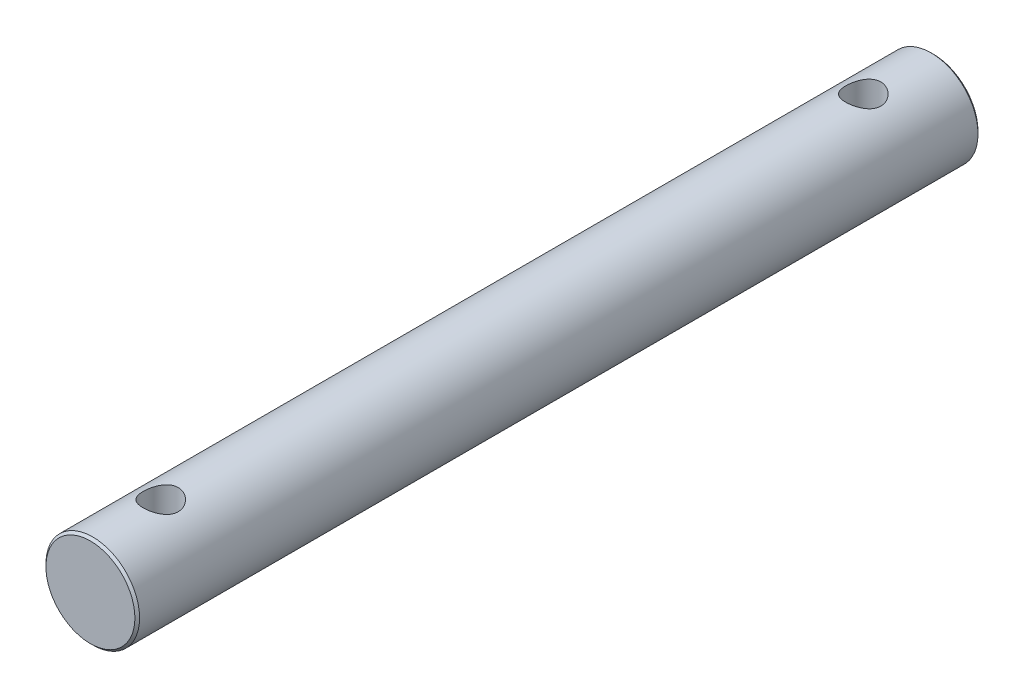
ISO-10303-21;
HEADER;
FILE_DESCRIPTION(('STEP AP214'),'2;1');
FILE_NAME('part.step','',(''),(''),'','','');
FILE_SCHEMA(('AUTOMOTIVE_DESIGN { 1 0 10303 214 1 1 1 1 }'));
ENDSEC;
DATA;
#1=APPLICATION_CONTEXT('core data for automotive mechanical design processes');
#2=APPLICATION_PROTOCOL_DEFINITION('international standard','automotive_design',2000,#1);
#3=PRODUCT_CONTEXT('',#1,'mechanical');
#4=PRODUCT('Part','Part','',(#3));
#5=PRODUCT_RELATED_PRODUCT_CATEGORY('part','',(#4));
#6=PRODUCT_DEFINITION_FORMATION('','',#4);
#7=PRODUCT_DEFINITION_CONTEXT('part definition',#1,'design');
#8=PRODUCT_DEFINITION('design','',#6,#7);
#9=PRODUCT_DEFINITION_SHAPE('','',#8);
#10=(LENGTH_UNIT() NAMED_UNIT(*) SI_UNIT(.MILLI.,.METRE.));
#11=(NAMED_UNIT(*) PLANE_ANGLE_UNIT() SI_UNIT($,.RADIAN.));
#12=(NAMED_UNIT(*) SI_UNIT($,.STERADIAN.) SOLID_ANGLE_UNIT());
#13=UNCERTAINTY_MEASURE_WITH_UNIT(LENGTH_MEASURE(1.E-05),#10,'distance_accuracy_value','');
#14=(GEOMETRIC_REPRESENTATION_CONTEXT(3) GLOBAL_UNCERTAINTY_ASSIGNED_CONTEXT((#13)) GLOBAL_UNIT_ASSIGNED_CONTEXT((#10,
#11,#12)) REPRESENTATION_CONTEXT('',''));
#15=CARTESIAN_POINT('',(0.,0.,0.));
#16=DIRECTION('',(0.,0.,1.));
#17=DIRECTION('',(1.,0.,0.));
#18=AXIS2_PLACEMENT_3D('',#15,#16,#17);
#19=CARTESIAN_POINT('',(0.,0.,26.));
#20=DIRECTION('',(0.,0.,-1.));
#21=DIRECTION('',(-1.,0.,0.));
#22=AXIS2_PLACEMENT_3D('',#19,#20,#21);
#23=CYLINDRICAL_SURFACE('',#22,4.);
#24=CARTESIAN_POINT('',(0.,0.,-35.8));
#25=DIRECTION('',(0.,0.,1.));
#26=DIRECTION('',(1.,0.,0.));
#27=AXIS2_PLACEMENT_3D('',#24,#25,#26);
#28=CIRCLE('',#27,4.);
#29=CARTESIAN_POINT('',(4.,0.,-35.8));
#30=VERTEX_POINT('',#29);
#31=EDGE_CURVE('E44',#30,#30,#28,.T.);
#32=ORIENTED_EDGE('',*,*,#31,.T.);
#33=EDGE_LOOP('',(#32));
#34=FACE_BOUND('',#33,.T.);
#35=CARTESIAN_POINT('',(0.,0.,35.8));
#36=DIRECTION('',(0.,0.,1.));
#37=DIRECTION('',(1.,0.,0.));
#38=AXIS2_PLACEMENT_3D('',#35,#36,#37);
#39=CIRCLE('',#38,4.);
#40=CARTESIAN_POINT('',(4.,0.,35.8));
#41=VERTEX_POINT('',#40);
#42=EDGE_CURVE('E48',#41,#41,#39,.F.);
#43=ORIENTED_EDGE('',*,*,#42,.T.);
#44=EDGE_LOOP('',(#43));
#45=FACE_BOUND('',#44,.T.);
#46=CARTESIAN_POINT('',(0.,-4.,-28.5));
#47=CARTESIAN_POINT('',(0.0812350589378531,-4.00000217456151,-28.4999970976969));
#48=CARTESIAN_POINT('',(0.162450241781793,-3.99750379283184,-28.5066197602484));
#49=CARTESIAN_POINT('',(0.322453452352362,-3.98778696006928,-28.5328281952699));
#50=CARTESIAN_POINT('',(0.401241827987616,-3.98056918893993,-28.5524121004706));
#51=CARTESIAN_POINT('',(0.554060784990879,-3.96218832391545,-28.6037530017718));
#52=CARTESIAN_POINT('',(0.628100224162277,-3.9510328434944,-28.6354865168218));
#53=CARTESIAN_POINT('',(0.769799310160253,-3.92588767765353,-28.7101064130158));
#54=CARTESIAN_POINT('',(0.83745723917788,-3.91189723227548,-28.7529957855442));
#55=CARTESIAN_POINT('',(0.967346417045827,-3.88186246971217,-28.8506125310709));
#56=CARTESIAN_POINT('',(1.02927073015119,-3.86576002583566,-28.9057302622594));
#57=CARTESIAN_POINT('',(1.14324421474363,-3.83360220871327,-29.0254104346588));
#58=CARTESIAN_POINT('',(1.19529036359203,-3.81754685135033,-29.0899757560879));
#59=CARTESIAN_POINT('',(1.28998202215985,-3.78662470617731,-29.2297174675232));
#60=CARTESIAN_POINT('',(1.3321939319576,-3.77182648820818,-29.3052043665458));
#61=CARTESIAN_POINT('',(1.40318646334085,-3.74599860237433,-29.4628483541685));
#62=CARTESIAN_POINT('',(1.43197244961239,-3.73496742975881,-29.5450027631551));
#63=CARTESIAN_POINT('',(1.47408431017549,-3.71854412824136,-29.7101167402582));
#64=CARTESIAN_POINT('',(1.48799593218558,-3.71293924350838,-29.7929050384354));
#65=CARTESIAN_POINT('',(1.50179556531648,-3.70738061461215,-29.9598161579938));
#66=CARTESIAN_POINT('',(1.50168936802631,-3.70742453659305,-30.0439384138745));
#67=CARTESIAN_POINT('',(1.48790429610018,-3.71297511632055,-30.205769525213));
#68=CARTESIAN_POINT('',(1.47503808509004,-3.71815468871121,-30.2835609060442));
#69=CARTESIAN_POINT('',(1.4374416786833,-3.73284938059529,-30.4357871504053));
#70=CARTESIAN_POINT('',(1.41270969663258,-3.74236515298863,-30.5102215066139));
#71=CARTESIAN_POINT('',(1.35163748571904,-3.76485702190253,-30.6552770677282));
#72=CARTESIAN_POINT('',(1.31508648737101,-3.77789517988166,-30.7257994861213));
#73=CARTESIAN_POINT('',(1.23156073762698,-3.80594210139319,-30.859945737591));
#74=CARTESIAN_POINT('',(1.18458238728897,-3.82095154457158,-30.9235671775197));
#75=CARTESIAN_POINT('',(1.07781780766549,-3.85248038859113,-31.0466036636509));
#76=CARTESIAN_POINT('',(1.01738298716955,-3.86903347455671,-31.1054486407481));
#77=CARTESIAN_POINT('',(0.887312590819019,-3.90091728164085,-31.2123379662058));
#78=CARTESIAN_POINT('',(0.817675603497362,-3.91624781465952,-31.2603806546057));
#79=CARTESIAN_POINT('',(0.669723436992418,-3.9442639480908,-31.3449303970625));
#80=CARTESIAN_POINT('',(0.591290713844717,-3.95690498259616,-31.3812475812211));
#81=CARTESIAN_POINT('',(0.428836850524581,-3.97778718326962,-31.43998260427));
#82=CARTESIAN_POINT('',(0.344818210845766,-3.98603030341493,-31.4624066165611));
#83=CARTESIAN_POINT('',(0.178375243148665,-3.99684443228065,-31.4916227875419));
#84=CARTESIAN_POINT('',(0.0961036195622091,-3.99969369025686,-31.4991826063825));
#85=CARTESIAN_POINT('',(-0.0685724752550243,-4.00025893700126,-31.5006910638999));
#86=CARTESIAN_POINT('',(-0.150976912983373,-3.99797606386863,-31.4946427203168));
#87=CARTESIAN_POINT('',(-0.310262048561861,-3.98871709772643,-31.4696899576913));
#88=CARTESIAN_POINT('',(-0.387233328007337,-3.98192470962305,-31.4512884562629));
#89=CARTESIAN_POINT('',(-0.536941754957223,-3.96451477091717,-31.4028139274527));
#90=CARTESIAN_POINT('',(-0.609678350347536,-3.9538967228203,-31.372739382052));
#91=CARTESIAN_POINT('',(-0.751247765110158,-3.92949624407681,-31.3008135875605));
#92=CARTESIAN_POINT('',(-0.819903083557798,-3.91563000209348,-31.2586422707766));
#93=CARTESIAN_POINT('',(-0.949392711726628,-3.88626671564664,-31.1640818968284));
#94=CARTESIAN_POINT('',(-1.01022412027045,-3.87076907009516,-31.1116890674548));
#95=CARTESIAN_POINT('',(-1.12603079874454,-3.83873329490989,-30.9945958778757));
#96=CARTESIAN_POINT('',(-1.18046154123569,-3.82218696503729,-30.9293578172273));
#97=CARTESIAN_POINT('',(-1.27771050031903,-3.79078815746854,-30.7903486152923));
#98=CARTESIAN_POINT('',(-1.32052767414519,-3.77593583194399,-30.7165767086115));
#99=CARTESIAN_POINT('',(-1.39337773518998,-3.74966829822463,-30.5619840132277));
#100=CARTESIAN_POINT('',(-1.42335685446918,-3.73826760328493,-30.4811352540896));
#101=CARTESIAN_POINT('',(-1.46907883466889,-3.72054032891005,-30.3149902363122));
#102=CARTESIAN_POINT('',(-1.48483050305535,-3.71421061057491,-30.2296967638019));
#103=CARTESIAN_POINT('',(-1.50086347097839,-3.70775894792573,-30.0629838404589));
#104=CARTESIAN_POINT('',(-1.50207331495838,-3.70726444523341,-29.9816673682831));
#105=CARTESIAN_POINT('',(-1.49136715641593,-3.71158412745292,-29.8200546837238));
#106=CARTESIAN_POINT('',(-1.47945239850124,-3.71639780898899,-29.7397583753284));
#107=CARTESIAN_POINT('',(-1.44355815630242,-3.73048141585432,-29.5849527732834));
#108=CARTESIAN_POINT('',(-1.41995798316524,-3.73961085376663,-29.5103416537547));
#109=CARTESIAN_POINT('',(-1.3616969677992,-3.76121548297845,-29.3660944915056));
#110=CARTESIAN_POINT('',(-1.32703332944945,-3.77369151995215,-29.2964597119299));
#111=CARTESIAN_POINT('',(-1.24552075938154,-3.80139723903964,-29.1601732103024));
#112=CARTESIAN_POINT('',(-1.1981283280301,-3.81673698440964,-29.0938692032001));
#113=CARTESIAN_POINT('',(-1.09334485729906,-3.84806246757177,-28.9698584390288));
#114=CARTESIAN_POINT('',(-1.03595064012808,-3.86404840943145,-28.9121544252132));
#115=CARTESIAN_POINT('',(-0.909080396784624,-3.89590424609881,-28.8037980441782));
#116=CARTESIAN_POINT('',(-0.839118644212992,-3.91172104900645,-28.7536962465653));
#117=CARTESIAN_POINT('',(-0.69121322320082,-3.94054514457031,-28.6659773447234));
#118=CARTESIAN_POINT('',(-0.61326893409062,-3.95355221851559,-28.6283612122636));
#119=CARTESIAN_POINT('',(-0.447999082002311,-3.9757429260668,-28.5656231709517));
#120=CARTESIAN_POINT('',(-0.360413422234207,-3.98473657158356,-28.5411129353981));
#121=CARTESIAN_POINT('',(-0.181875733606381,-3.99686242179587,-28.5083070400793));
#122=CARTESIAN_POINT('',(-0.0909254163648585,-3.99999756603967,-28.5000032485127));
#123=CARTESIAN_POINT('',(0.,-4.,-28.5));
#124=B_SPLINE_CURVE_WITH_KNOTS('',3,(#46,#47,#48,#49,#50,#51,#52,#53,#54,#55,#56,#57,#58,#59,
#60,#61,#62,#63,#64,#65,#66,#67,#68,#69,#70,#71,#72,#73,#74,#75,#76,#77,#78,#79,#80,#81,#82,#83,
#84,#85,#86,#87,#88,#89,#90,#91,#92,#93,#94,#95,#96,#97,#98,#99,#100,#101,#102,#103,#104,#105,
#106,#107,#108,#109,#110,#111,#112,#113,#114,#115,#116,#117,#118,#119,#120,#121,#122,#123),
.UNSPECIFIED.,.T.,.F.,(4,2,2,2,2,2,2,2,2,2,2,2,2,2,2,2,2,2,2,2,2,2,2,2,2,2,2,2,2,2,2,2,2,2,2,2,
2,2,4),(0.,0.24336980156056,0.486704549530461,0.729571369213572,0.972503379609491,
1.22473618582716,1.47704604925622,1.73896674501659,2.00078269352134,2.25185874416902,
2.50283106079707,2.73878345119972,2.9747713806059,3.21522408387019,3.45575990744259,
3.71246153335814,3.96920257905067,4.22991375286076,4.49050899698846,4.73725019635926,
4.98393668390521,5.22114437923841,5.45838293254454,5.70259221859601,5.94689180019869,
6.20536519455659,6.46386178920142,6.72343066727204,6.98283874956508,7.22558763480253,
7.4683135021126,7.70363142426535,7.93900886656507,8.18672471884272,8.43451941997063,
8.6957232965404,8.95694749805103,9.22948515032044,9.50188601796129),.UNSPECIFIED.);
#125=CARTESIAN_POINT('',(0.,-4.,-28.5));
#126=VERTEX_POINT('',#125);
#127=EDGE_CURVE('E85',#126,#126,#124,.T.);
#128=ORIENTED_EDGE('',*,*,#127,.T.);
#129=EDGE_LOOP('',(#128));
#130=FACE_BOUND('',#129,.T.);
#131=CARTESIAN_POINT('',(0.,4.,-28.5));
#132=CARTESIAN_POINT('',(-0.0812350589378531,4.00000217456151,-28.4999970976969));
#133=CARTESIAN_POINT('',(-0.162450241781793,3.99750379283184,-28.5066197602484));
#134=CARTESIAN_POINT('',(-0.322453452352362,3.98778696006928,-28.5328281952699));
#135=CARTESIAN_POINT('',(-0.401241827987616,3.98056918893993,-28.5524121004706));
#136=CARTESIAN_POINT('',(-0.554060784990879,3.96218832391545,-28.6037530017718));
#137=CARTESIAN_POINT('',(-0.628100224162277,3.9510328434944,-28.6354865168218));
#138=CARTESIAN_POINT('',(-0.769799310160253,3.92588767765353,-28.7101064130158));
#139=CARTESIAN_POINT('',(-0.83745723917788,3.91189723227548,-28.7529957855442));
#140=CARTESIAN_POINT('',(-0.967346417045827,3.88186246971217,-28.8506125310709));
#141=CARTESIAN_POINT('',(-1.02927073015119,3.86576002583566,-28.9057302622594));
#142=CARTESIAN_POINT('',(-1.14324421474363,3.83360220871327,-29.0254104346588));
#143=CARTESIAN_POINT('',(-1.19529036359203,3.81754685135033,-29.0899757560879));
#144=CARTESIAN_POINT('',(-1.28998202215985,3.78662470617731,-29.2297174675232));
#145=CARTESIAN_POINT('',(-1.3321939319576,3.77182648820818,-29.3052043665458));
#146=CARTESIAN_POINT('',(-1.40318646334085,3.74599860237433,-29.4628483541685));
#147=CARTESIAN_POINT('',(-1.43197244961239,3.73496742975881,-29.5450027631551));
#148=CARTESIAN_POINT('',(-1.47408431017549,3.71854412824136,-29.7101167402582));
#149=CARTESIAN_POINT('',(-1.48799593218558,3.71293924350838,-29.7929050384354));
#150=CARTESIAN_POINT('',(-1.50179556531648,3.70738061461215,-29.9598161579938));
#151=CARTESIAN_POINT('',(-1.50168936802631,3.70742453659305,-30.0439384138745));
#152=CARTESIAN_POINT('',(-1.48790429610018,3.71297511632055,-30.205769525213));
#153=CARTESIAN_POINT('',(-1.47503808509004,3.71815468871121,-30.2835609060442));
#154=CARTESIAN_POINT('',(-1.4374416786833,3.73284938059529,-30.4357871504053));
#155=CARTESIAN_POINT('',(-1.41270969663258,3.74236515298863,-30.5102215066139));
#156=CARTESIAN_POINT('',(-1.35163748571904,3.76485702190253,-30.6552770677282));
#157=CARTESIAN_POINT('',(-1.31508648737101,3.77789517988166,-30.7257994861213));
#158=CARTESIAN_POINT('',(-1.23156073762698,3.80594210139319,-30.859945737591));
#159=CARTESIAN_POINT('',(-1.18458238728897,3.82095154457158,-30.9235671775197));
#160=CARTESIAN_POINT('',(-1.07781780766549,3.85248038859113,-31.0466036636509));
#161=CARTESIAN_POINT('',(-1.01738298716955,3.86903347455671,-31.1054486407481));
#162=CARTESIAN_POINT('',(-0.887312590819019,3.90091728164085,-31.2123379662058));
#163=CARTESIAN_POINT('',(-0.817675603497362,3.91624781465952,-31.2603806546057));
#164=CARTESIAN_POINT('',(-0.669723436992418,3.9442639480908,-31.3449303970625));
#165=CARTESIAN_POINT('',(-0.591290713844717,3.95690498259616,-31.3812475812211));
#166=CARTESIAN_POINT('',(-0.428836850524581,3.97778718326962,-31.43998260427));
#167=CARTESIAN_POINT('',(-0.344818210845766,3.98603030341493,-31.4624066165611));
#168=CARTESIAN_POINT('',(-0.178375243148665,3.99684443228065,-31.4916227875419));
#169=CARTESIAN_POINT('',(-0.0961036195622091,3.99969369025686,-31.4991826063825));
#170=CARTESIAN_POINT('',(0.0685724752550243,4.00025893700126,-31.5006910638999));
#171=CARTESIAN_POINT('',(0.150976912983373,3.99797606386863,-31.4946427203168));
#172=CARTESIAN_POINT('',(0.310262048561861,3.98871709772643,-31.4696899576913));
#173=CARTESIAN_POINT('',(0.387233328007337,3.98192470962305,-31.4512884562629));
#174=CARTESIAN_POINT('',(0.536941754957223,3.96451477091717,-31.4028139274527));
#175=CARTESIAN_POINT('',(0.609678350347536,3.9538967228203,-31.372739382052));
#176=CARTESIAN_POINT('',(0.751247765110158,3.92949624407681,-31.3008135875605));
#177=CARTESIAN_POINT('',(0.819903083557798,3.91563000209348,-31.2586422707766));
#178=CARTESIAN_POINT('',(0.949392711726628,3.88626671564664,-31.1640818968284));
#179=CARTESIAN_POINT('',(1.01022412027045,3.87076907009516,-31.1116890674548));
#180=CARTESIAN_POINT('',(1.12603079874454,3.83873329490989,-30.9945958778757));
#181=CARTESIAN_POINT('',(1.18046154123569,3.82218696503729,-30.9293578172273));
#182=CARTESIAN_POINT('',(1.27771050031903,3.79078815746854,-30.7903486152923));
#183=CARTESIAN_POINT('',(1.32052767414519,3.77593583194399,-30.7165767086115));
#184=CARTESIAN_POINT('',(1.39337773518998,3.74966829822463,-30.5619840132277));
#185=CARTESIAN_POINT('',(1.42335685446918,3.73826760328493,-30.4811352540896));
#186=CARTESIAN_POINT('',(1.46907883466889,3.72054032891005,-30.3149902363122));
#187=CARTESIAN_POINT('',(1.48483050305535,3.71421061057491,-30.2296967638019));
#188=CARTESIAN_POINT('',(1.50086347097839,3.70775894792573,-30.0629838404589));
#189=CARTESIAN_POINT('',(1.50207331495838,3.70726444523341,-29.9816673682831));
#190=CARTESIAN_POINT('',(1.49136715641593,3.71158412745292,-29.8200546837238));
#191=CARTESIAN_POINT('',(1.47945239850124,3.71639780898899,-29.7397583753284));
#192=CARTESIAN_POINT('',(1.44355815630242,3.73048141585432,-29.5849527732834));
#193=CARTESIAN_POINT('',(1.41995798316524,3.73961085376663,-29.5103416537547));
#194=CARTESIAN_POINT('',(1.3616969677992,3.76121548297845,-29.3660944915056));
#195=CARTESIAN_POINT('',(1.32703332944945,3.77369151995215,-29.2964597119299));
#196=CARTESIAN_POINT('',(1.24552075938154,3.80139723903964,-29.1601732103024));
#197=CARTESIAN_POINT('',(1.1981283280301,3.81673698440964,-29.0938692032001));
#198=CARTESIAN_POINT('',(1.09334485729906,3.84806246757177,-28.9698584390288));
#199=CARTESIAN_POINT('',(1.03595064012808,3.86404840943145,-28.9121544252132));
#200=CARTESIAN_POINT('',(0.909080396784624,3.89590424609881,-28.8037980441782));
#201=CARTESIAN_POINT('',(0.839118644212992,3.91172104900645,-28.7536962465653));
#202=CARTESIAN_POINT('',(0.69121322320082,3.94054514457031,-28.6659773447234));
#203=CARTESIAN_POINT('',(0.61326893409062,3.95355221851559,-28.6283612122636));
#204=CARTESIAN_POINT('',(0.447999082002311,3.9757429260668,-28.5656231709517));
#205=CARTESIAN_POINT('',(0.360413422234207,3.98473657158356,-28.5411129353981));
#206=CARTESIAN_POINT('',(0.181875733606381,3.99686242179587,-28.5083070400793));
#207=CARTESIAN_POINT('',(0.0909254163648585,3.99999756603967,-28.5000032485127));
#208=CARTESIAN_POINT('',(0.,4.,-28.5));
#209=B_SPLINE_CURVE_WITH_KNOTS('',3,(#131,#132,#133,#134,#135,#136,#137,#138,#139,#140,#141,
#142,#143,#144,#145,#146,#147,#148,#149,#150,#151,#152,#153,#154,#155,#156,#157,#158,#159,#160,
#161,#162,#163,#164,#165,#166,#167,#168,#169,#170,#171,#172,#173,#174,#175,#176,#177,#178,#179,
#180,#181,#182,#183,#184,#185,#186,#187,#188,#189,#190,#191,#192,#193,#194,#195,#196,#197,#198,
#199,#200,#201,#202,#203,#204,#205,#206,#207,#208),.UNSPECIFIED.,.T.,.F.,(4,2,2,2,2,2,2,2,2,2,2,
2,2,2,2,2,2,2,2,2,2,2,2,2,2,2,2,2,2,2,2,2,2,2,2,2,2,2,4),(0.,0.24336980156056,0.486704549530461,
0.729571369213572,0.972503379609491,1.22473618582716,1.47704604925622,1.73896674501659,
2.00078269352134,2.25185874416902,2.50283106079707,2.73878345119972,2.9747713806059,
3.21522408387019,3.45575990744259,3.71246153335814,3.96920257905067,4.22991375286076,
4.49050899698846,4.73725019635926,4.98393668390521,5.22114437923841,5.45838293254454,
5.70259221859601,5.94689180019869,6.20536519455659,6.46386178920142,6.72343066727204,
6.98283874956508,7.22558763480253,7.4683135021126,7.70363142426535,7.93900886656507,
8.18672471884272,8.43451941997063,8.6957232965404,8.95694749805103,9.22948515032044,
9.50188601796129),.UNSPECIFIED.);
#210=CARTESIAN_POINT('',(0.,4.,-28.5));
#211=VERTEX_POINT('',#210);
#212=EDGE_CURVE('E82',#211,#211,#209,.T.);
#213=ORIENTED_EDGE('',*,*,#212,.T.);
#214=EDGE_LOOP('',(#213));
#215=FACE_BOUND('',#214,.T.);
#216=CARTESIAN_POINT('',(0.,4.,31.5));
#217=CARTESIAN_POINT('',(0.0812350589378532,4.00000217456151,31.5000029023031));
#218=CARTESIAN_POINT('',(0.162450241781793,3.99750379283184,31.4933802397516));
#219=CARTESIAN_POINT('',(0.322453452352362,3.98778696006928,31.4671718047301));
#220=CARTESIAN_POINT('',(0.401241827987617,3.98056918893993,31.4475878995294));
#221=CARTESIAN_POINT('',(0.55406078499088,3.96218832391545,31.3962469982282));
#222=CARTESIAN_POINT('',(0.628100224162279,3.9510328434944,31.3645134831782));
#223=CARTESIAN_POINT('',(0.769799310160255,3.92588767765353,31.2898935869842));
#224=CARTESIAN_POINT('',(0.837457239177881,3.91189723227548,31.2470042144558));
#225=CARTESIAN_POINT('',(0.967346417045827,3.88186246971217,31.1493874689291));
#226=CARTESIAN_POINT('',(1.02927073015119,3.86576002583566,31.0942697377406));
#227=CARTESIAN_POINT('',(1.14324421474363,3.83360220871327,30.9745895653412));
#228=CARTESIAN_POINT('',(1.19529036359203,3.81754685135033,30.9100242439121));
#229=CARTESIAN_POINT('',(1.28998202215985,3.78662470617731,30.7702825324768));
#230=CARTESIAN_POINT('',(1.3321939319576,3.77182648820818,30.6947956334542));
#231=CARTESIAN_POINT('',(1.40318646334085,3.74599860237433,30.5371516458315));
#232=CARTESIAN_POINT('',(1.43197244961239,3.73496742975881,30.4549972368449));
#233=CARTESIAN_POINT('',(1.47408431017549,3.71854412824136,30.2898832597418));
#234=CARTESIAN_POINT('',(1.48799593218558,3.71293924350838,30.2070949615646));
#235=CARTESIAN_POINT('',(1.50179556531648,3.70738061461215,30.0401838420062));
#236=CARTESIAN_POINT('',(1.50168936802631,3.70742453659305,29.9560615861255));
#237=CARTESIAN_POINT('',(1.48790429610018,3.71297511632054,29.794230474787));
#238=CARTESIAN_POINT('',(1.47503808509004,3.71815468871121,29.7164390939558));
#239=CARTESIAN_POINT('',(1.4374416786833,3.73284938059529,29.5642128495947));
#240=CARTESIAN_POINT('',(1.41270969663259,3.74236515298863,29.4897784933861));
#241=CARTESIAN_POINT('',(1.35163748571904,3.76485702190253,29.3447229322718));
#242=CARTESIAN_POINT('',(1.31508648737101,3.77789517988166,29.2742005138787));
#243=CARTESIAN_POINT('',(1.23156073762698,3.80594210139319,29.140054262409));
#244=CARTESIAN_POINT('',(1.18458238728897,3.82095154457158,29.0764328224803));
#245=CARTESIAN_POINT('',(1.07781780766549,3.85248038859113,28.9533963363491));
#246=CARTESIAN_POINT('',(1.01738298716956,3.86903347455671,28.8945513592519));
#247=CARTESIAN_POINT('',(0.887312590819022,3.90091728164085,28.7876620337942));
#248=CARTESIAN_POINT('',(0.817675603497366,3.91624781465952,28.7396193453943));
#249=CARTESIAN_POINT('',(0.669723436992423,3.9442639480908,28.6550696029375));
#250=CARTESIAN_POINT('',(0.591290713844723,3.95690498259616,28.6187524187789));
#251=CARTESIAN_POINT('',(0.428836850524587,3.97778718326962,28.56001739573));
#252=CARTESIAN_POINT('',(0.34481821084577,3.98603030341493,28.5375933834389));
#253=CARTESIAN_POINT('',(0.178375243148666,3.99684443228065,28.5083772124581));
#254=CARTESIAN_POINT('',(0.0961036195622102,3.99969369025686,28.5008173936175));
#255=CARTESIAN_POINT('',(-0.0685724752550239,4.00025893700126,28.4993089361001));
#256=CARTESIAN_POINT('',(-0.150976912983373,3.99797606386863,28.5053572796832));
#257=CARTESIAN_POINT('',(-0.31026204856186,3.98871709772643,28.5303100423087));
#258=CARTESIAN_POINT('',(-0.387233328007336,3.98192470962305,28.5487115437371));
#259=CARTESIAN_POINT('',(-0.536941754957222,3.96451477091717,28.5971860725473));
#260=CARTESIAN_POINT('',(-0.609678350347535,3.9538967228203,28.627260617948));
#261=CARTESIAN_POINT('',(-0.751247765110156,3.92949624407681,28.6991864124395));
#262=CARTESIAN_POINT('',(-0.819903083557796,3.91563000209348,28.7413577292234));
#263=CARTESIAN_POINT('',(-0.949392711726626,3.88626671564664,28.8359181031716));
#264=CARTESIAN_POINT('',(-1.01022412027045,3.87076907009516,28.8883109325451));
#265=CARTESIAN_POINT('',(-1.12603079874454,3.8387332949099,29.0054041221243));
#266=CARTESIAN_POINT('',(-1.18046154123569,3.82218696503729,29.0706421827727));
#267=CARTESIAN_POINT('',(-1.27771050031903,3.79078815746853,29.2096513847077));
#268=CARTESIAN_POINT('',(-1.32052767414519,3.77593583194399,29.2834232913885));
#269=CARTESIAN_POINT('',(-1.39337773518998,3.74966829822463,29.4380159867723));
#270=CARTESIAN_POINT('',(-1.42335685446918,3.73826760328493,29.5188647459104));
#271=CARTESIAN_POINT('',(-1.46907883466889,3.72054032891005,29.6850097636878));
#272=CARTESIAN_POINT('',(-1.48483050305535,3.71421061057491,29.7703032361981));
#273=CARTESIAN_POINT('',(-1.50086347097839,3.70775894792573,29.9370161595411));
#274=CARTESIAN_POINT('',(-1.50207331495838,3.70726444523341,30.0183326317169));
#275=CARTESIAN_POINT('',(-1.49136715641593,3.71158412745292,30.1799453162762));
#276=CARTESIAN_POINT('',(-1.47945239850124,3.71639780898899,30.2602416246716));
#277=CARTESIAN_POINT('',(-1.44355815630242,3.73048141585432,30.4150472267166));
#278=CARTESIAN_POINT('',(-1.41995798316524,3.73961085376663,30.4896583462453));
#279=CARTESIAN_POINT('',(-1.3616969677992,3.76121548297845,30.6339055084944));
#280=CARTESIAN_POINT('',(-1.32703332944945,3.77369151995215,30.7035402880701));
#281=CARTESIAN_POINT('',(-1.24552075938154,3.80139723903964,30.8398267896976));
#282=CARTESIAN_POINT('',(-1.1981283280301,3.81673698440964,30.9061307967999));
#283=CARTESIAN_POINT('',(-1.09334485729906,3.84806246757177,31.0301415609712));
#284=CARTESIAN_POINT('',(-1.03595064012808,3.86404840943145,31.0878455747868));
#285=CARTESIAN_POINT('',(-0.909080396784622,3.89590424609881,31.1962019558218));
#286=CARTESIAN_POINT('',(-0.839118644212992,3.91172104900645,31.2463037534347));
#287=CARTESIAN_POINT('',(-0.691213223200821,3.94054514457031,31.3340226552766));
#288=CARTESIAN_POINT('',(-0.613268934090623,3.95355221851559,31.3716387877364));
#289=CARTESIAN_POINT('',(-0.447999082002315,3.9757429260668,31.4343768290483));
#290=CARTESIAN_POINT('',(-0.360413422234212,3.98473657158356,31.4588870646019));
#291=CARTESIAN_POINT('',(-0.181875733606385,3.99686242179587,31.4916929599207));
#292=CARTESIAN_POINT('',(-0.0909254163648607,3.99999756603967,31.4999967514873));
#293=CARTESIAN_POINT('',(0.,4.,31.5));
#294=B_SPLINE_CURVE_WITH_KNOTS('',3,(#216,#217,#218,#219,#220,#221,#222,#223,#224,#225,#226,
#227,#228,#229,#230,#231,#232,#233,#234,#235,#236,#237,#238,#239,#240,#241,#242,#243,#244,#245,
#246,#247,#248,#249,#250,#251,#252,#253,#254,#255,#256,#257,#258,#259,#260,#261,#262,#263,#264,
#265,#266,#267,#268,#269,#270,#271,#272,#273,#274,#275,#276,#277,#278,#279,#280,#281,#282,#283,
#284,#285,#286,#287,#288,#289,#290,#291,#292,#293),.UNSPECIFIED.,.T.,.F.,(4,2,2,2,2,2,2,2,2,2,2,
2,2,2,2,2,2,2,2,2,2,2,2,2,2,2,2,2,2,2,2,2,2,2,2,2,2,2,4),(0.,0.243369801560561,
0.486704549530461,0.729571369213577,0.972503379609491,1.22473618582716,1.47704604925622,
1.73896674501658,2.00078269352134,2.25185874416902,2.50283106079708,2.73878345119972,
2.9747713806059,3.21522408387019,3.45575990744259,3.71246153335814,3.96920257905066,
4.22991375286075,4.49050899698846,4.73725019635926,4.98393668390521,5.22114437923841,
5.45838293254454,5.702592218596,5.94689180019869,6.20536519455659,6.46386178920142,
6.72343066727205,6.98283874956508,7.22558763480253,7.4683135021126,7.70363142426534,
7.93900886656507,8.18672471884272,8.43451941997064,8.69572329654041,8.95694749805103,
9.22948515032043,9.50188601796129),.UNSPECIFIED.);
#295=CARTESIAN_POINT('',(0.,4.,31.5));
#296=VERTEX_POINT('',#295);
#297=EDGE_CURVE('E60',#296,#296,#294,.T.);
#298=ORIENTED_EDGE('',*,*,#297,.F.);
#299=EDGE_LOOP('',(#298));
#300=FACE_BOUND('',#299,.T.);
#301=CARTESIAN_POINT('',(0.,-4.,31.5));
#302=CARTESIAN_POINT('',(-0.0812350589378532,-4.00000217456151,31.5000029023031));
#303=CARTESIAN_POINT('',(-0.162450241781793,-3.99750379283184,31.4933802397516));
#304=CARTESIAN_POINT('',(-0.322453452352362,-3.98778696006928,31.4671718047301));
#305=CARTESIAN_POINT('',(-0.401241827987617,-3.98056918893993,31.4475878995294));
#306=CARTESIAN_POINT('',(-0.55406078499088,-3.96218832391545,31.3962469982282));
#307=CARTESIAN_POINT('',(-0.628100224162279,-3.9510328434944,31.3645134831782));
#308=CARTESIAN_POINT('',(-0.769799310160255,-3.92588767765353,31.2898935869842));
#309=CARTESIAN_POINT('',(-0.837457239177881,-3.91189723227548,31.2470042144558));
#310=CARTESIAN_POINT('',(-0.967346417045827,-3.88186246971217,31.1493874689291));
#311=CARTESIAN_POINT('',(-1.02927073015119,-3.86576002583566,31.0942697377406));
#312=CARTESIAN_POINT('',(-1.14324421474363,-3.83360220871327,30.9745895653412));
#313=CARTESIAN_POINT('',(-1.19529036359203,-3.81754685135033,30.9100242439121));
#314=CARTESIAN_POINT('',(-1.28998202215985,-3.78662470617731,30.7702825324768));
#315=CARTESIAN_POINT('',(-1.3321939319576,-3.77182648820818,30.6947956334542));
#316=CARTESIAN_POINT('',(-1.40318646334085,-3.74599860237433,30.5371516458315));
#317=CARTESIAN_POINT('',(-1.43197244961239,-3.73496742975881,30.4549972368449));
#318=CARTESIAN_POINT('',(-1.47408431017549,-3.71854412824136,30.2898832597418));
#319=CARTESIAN_POINT('',(-1.48799593218558,-3.71293924350838,30.2070949615646));
#320=CARTESIAN_POINT('',(-1.50179556531648,-3.70738061461215,30.0401838420062));
#321=CARTESIAN_POINT('',(-1.50168936802631,-3.70742453659305,29.9560615861255));
#322=CARTESIAN_POINT('',(-1.48790429610018,-3.71297511632054,29.794230474787));
#323=CARTESIAN_POINT('',(-1.47503808509004,-3.71815468871121,29.7164390939558));
#324=CARTESIAN_POINT('',(-1.4374416786833,-3.73284938059529,29.5642128495947));
#325=CARTESIAN_POINT('',(-1.41270969663259,-3.74236515298863,29.4897784933861));
#326=CARTESIAN_POINT('',(-1.35163748571904,-3.76485702190253,29.3447229322718));
#327=CARTESIAN_POINT('',(-1.31508648737101,-3.77789517988166,29.2742005138787));
#328=CARTESIAN_POINT('',(-1.23156073762698,-3.80594210139319,29.140054262409));
#329=CARTESIAN_POINT('',(-1.18458238728897,-3.82095154457158,29.0764328224803));
#330=CARTESIAN_POINT('',(-1.07781780766549,-3.85248038859113,28.9533963363491));
#331=CARTESIAN_POINT('',(-1.01738298716956,-3.86903347455671,28.8945513592519));
#332=CARTESIAN_POINT('',(-0.887312590819022,-3.90091728164085,28.7876620337942));
#333=CARTESIAN_POINT('',(-0.817675603497366,-3.91624781465952,28.7396193453943));
#334=CARTESIAN_POINT('',(-0.669723436992423,-3.9442639480908,28.6550696029375));
#335=CARTESIAN_POINT('',(-0.591290713844723,-3.95690498259616,28.6187524187789));
#336=CARTESIAN_POINT('',(-0.428836850524587,-3.97778718326962,28.56001739573));
#337=CARTESIAN_POINT('',(-0.34481821084577,-3.98603030341493,28.5375933834389));
#338=CARTESIAN_POINT('',(-0.178375243148666,-3.99684443228065,28.5083772124581));
#339=CARTESIAN_POINT('',(-0.0961036195622102,-3.99969369025686,28.5008173936175));
#340=CARTESIAN_POINT('',(0.0685724752550239,-4.00025893700126,28.4993089361001));
#341=CARTESIAN_POINT('',(0.150976912983373,-3.99797606386863,28.5053572796832));
#342=CARTESIAN_POINT('',(0.31026204856186,-3.98871709772643,28.5303100423087));
#343=CARTESIAN_POINT('',(0.387233328007336,-3.98192470962305,28.5487115437371));
#344=CARTESIAN_POINT('',(0.536941754957222,-3.96451477091717,28.5971860725473));
#345=CARTESIAN_POINT('',(0.609678350347535,-3.9538967228203,28.627260617948));
#346=CARTESIAN_POINT('',(0.751247765110156,-3.92949624407681,28.6991864124395));
#347=CARTESIAN_POINT('',(0.819903083557796,-3.91563000209348,28.7413577292234));
#348=CARTESIAN_POINT('',(0.949392711726626,-3.88626671564664,28.8359181031716));
#349=CARTESIAN_POINT('',(1.01022412027045,-3.87076907009516,28.8883109325451));
#350=CARTESIAN_POINT('',(1.12603079874454,-3.8387332949099,29.0054041221243));
#351=CARTESIAN_POINT('',(1.18046154123569,-3.82218696503729,29.0706421827727));
#352=CARTESIAN_POINT('',(1.27771050031903,-3.79078815746853,29.2096513847077));
#353=CARTESIAN_POINT('',(1.32052767414519,-3.77593583194399,29.2834232913885));
#354=CARTESIAN_POINT('',(1.39337773518998,-3.74966829822463,29.4380159867723));
#355=CARTESIAN_POINT('',(1.42335685446918,-3.73826760328493,29.5188647459104));
#356=CARTESIAN_POINT('',(1.46907883466889,-3.72054032891005,29.6850097636878));
#357=CARTESIAN_POINT('',(1.48483050305535,-3.71421061057491,29.7703032361981));
#358=CARTESIAN_POINT('',(1.50086347097839,-3.70775894792573,29.9370161595411));
#359=CARTESIAN_POINT('',(1.50207331495838,-3.70726444523341,30.0183326317169));
#360=CARTESIAN_POINT('',(1.49136715641593,-3.71158412745292,30.1799453162762));
#361=CARTESIAN_POINT('',(1.47945239850124,-3.71639780898899,30.2602416246716));
#362=CARTESIAN_POINT('',(1.44355815630242,-3.73048141585432,30.4150472267166));
#363=CARTESIAN_POINT('',(1.41995798316524,-3.73961085376663,30.4896583462453));
#364=CARTESIAN_POINT('',(1.3616969677992,-3.76121548297845,30.6339055084944));
#365=CARTESIAN_POINT('',(1.32703332944945,-3.77369151995215,30.7035402880701));
#366=CARTESIAN_POINT('',(1.24552075938154,-3.80139723903964,30.8398267896976));
#367=CARTESIAN_POINT('',(1.1981283280301,-3.81673698440964,30.9061307967999));
#368=CARTESIAN_POINT('',(1.09334485729906,-3.84806246757177,31.0301415609712));
#369=CARTESIAN_POINT('',(1.03595064012808,-3.86404840943145,31.0878455747868));
#370=CARTESIAN_POINT('',(0.909080396784622,-3.89590424609881,31.1962019558218));
#371=CARTESIAN_POINT('',(0.839118644212992,-3.91172104900645,31.2463037534347));
#372=CARTESIAN_POINT('',(0.691213223200821,-3.94054514457031,31.3340226552766));
#373=CARTESIAN_POINT('',(0.613268934090623,-3.95355221851559,31.3716387877364));
#374=CARTESIAN_POINT('',(0.447999082002315,-3.9757429260668,31.4343768290483));
#375=CARTESIAN_POINT('',(0.360413422234212,-3.98473657158356,31.4588870646019));
#376=CARTESIAN_POINT('',(0.181875733606385,-3.99686242179587,31.4916929599207));
#377=CARTESIAN_POINT('',(0.0909254163648607,-3.99999756603967,31.4999967514873));
#378=CARTESIAN_POINT('',(0.,-4.,31.5));
#379=B_SPLINE_CURVE_WITH_KNOTS('',3,(#301,#302,#303,#304,#305,#306,#307,#308,#309,#310,#311,
#312,#313,#314,#315,#316,#317,#318,#319,#320,#321,#322,#323,#324,#325,#326,#327,#328,#329,#330,
#331,#332,#333,#334,#335,#336,#337,#338,#339,#340,#341,#342,#343,#344,#345,#346,#347,#348,#349,
#350,#351,#352,#353,#354,#355,#356,#357,#358,#359,#360,#361,#362,#363,#364,#365,#366,#367,#368,
#369,#370,#371,#372,#373,#374,#375,#376,#377,#378),.UNSPECIFIED.,.T.,.F.,(4,2,2,2,2,2,2,2,2,2,2,
2,2,2,2,2,2,2,2,2,2,2,2,2,2,2,2,2,2,2,2,2,2,2,2,2,2,2,4),(0.,0.243369801560561,
0.486704549530461,0.729571369213577,0.972503379609491,1.22473618582716,1.47704604925622,
1.73896674501658,2.00078269352134,2.25185874416902,2.50283106079708,2.73878345119972,
2.9747713806059,3.21522408387019,3.45575990744259,3.71246153335814,3.96920257905066,
4.22991375286075,4.49050899698846,4.73725019635926,4.98393668390521,5.22114437923841,
5.45838293254454,5.702592218596,5.94689180019869,6.20536519455659,6.46386178920142,
6.72343066727205,6.98283874956508,7.22558763480253,7.4683135021126,7.70363142426534,
7.93900886656507,8.18672471884272,8.43451941997064,8.69572329654041,8.95694749805103,
9.22948515032043,9.50188601796129),.UNSPECIFIED.);
#380=CARTESIAN_POINT('',(0.,-4.,31.5));
#381=VERTEX_POINT('',#380);
#382=EDGE_CURVE('E53',#381,#381,#379,.T.);
#383=ORIENTED_EDGE('',*,*,#382,.F.);
#384=EDGE_LOOP('',(#383));
#385=FACE_BOUND('',#384,.T.);
#386=ADVANCED_FACE('F33',(#34,#45,#130,#215,#300,#385),#23,.T.);
#387=CARTESIAN_POINT('',(0.,0.,36.));
#388=DIRECTION('',(0.,0.,1.));
#389=DIRECTION('',(1.,0.,0.));
#390=AXIS2_PLACEMENT_3D('',#387,#388,#389);
#391=PLANE('',#390);
#392=CARTESIAN_POINT('',(0.,0.,36.));
#393=DIRECTION('',(0.,0.,1.));
#394=DIRECTION('',(1.,0.,0.));
#395=AXIS2_PLACEMENT_3D('',#392,#393,#394);
#396=CIRCLE('',#395,3.80000000000002);
#397=CARTESIAN_POINT('',(3.80000000000002,0.,36.));
#398=VERTEX_POINT('',#397);
#399=EDGE_CURVE('E10',#398,#398,#396,.T.);
#400=ORIENTED_EDGE('',*,*,#399,.T.);
#401=EDGE_LOOP('',(#400));
#402=FACE_BOUND('',#401,.T.);
#403=ADVANCED_FACE('F79',(#402),#391,.T.);
#404=CARTESIAN_POINT('',(0.,0.,-36.));
#405=DIRECTION('',(0.,0.,1.));
#406=DIRECTION('',(1.,0.,0.));
#407=AXIS2_PLACEMENT_3D('',#404,#405,#406);
#408=PLANE('',#407);
#409=CARTESIAN_POINT('',(0.,0.,-36.));
#410=DIRECTION('',(0.,0.,1.));
#411=DIRECTION('',(1.,0.,0.));
#412=AXIS2_PLACEMENT_3D('',#409,#410,#411);
#413=CIRCLE('',#412,3.79999999999998);
#414=CARTESIAN_POINT('',(3.79999999999998,0.,-36.));
#415=VERTEX_POINT('',#414);
#416=EDGE_CURVE('E40',#415,#415,#413,.F.);
#417=ORIENTED_EDGE('',*,*,#416,.T.);
#418=EDGE_LOOP('',(#417));
#419=FACE_BOUND('',#418,.T.);
#420=ADVANCED_FACE('F77',(#419),#408,.F.);
#421=CARTESIAN_POINT('',(0.,-4.,-30.));
#422=DIRECTION('',(0.,1.,0.));
#423=DIRECTION('',(0.,0.,1.));
#424=AXIS2_PLACEMENT_3D('',#421,#422,#423);
#425=CYLINDRICAL_SURFACE('',#424,1.5);
#426=ORIENTED_EDGE('',*,*,#212,.F.);
#427=EDGE_LOOP('',(#426));
#428=FACE_BOUND('',#427,.T.);
#429=ORIENTED_EDGE('',*,*,#127,.F.);
#430=EDGE_LOOP('',(#429));
#431=FACE_BOUND('',#430,.T.);
#432=ADVANCED_FACE('F71',(#428,#431),#425,.F.);
#433=CARTESIAN_POINT('',(0.,-4.,30.));
#434=DIRECTION('',(0.,1.,0.));
#435=DIRECTION('',(0.,0.,1.));
#436=AXIS2_PLACEMENT_3D('',#433,#434,#435);
#437=CYLINDRICAL_SURFACE('',#436,1.5);
#438=ORIENTED_EDGE('',*,*,#297,.T.);
#439=EDGE_LOOP('',(#438));
#440=FACE_BOUND('',#439,.T.);
#441=ORIENTED_EDGE('',*,*,#382,.T.);
#442=EDGE_LOOP('',(#441));
#443=FACE_BOUND('',#442,.T.);
#444=ADVANCED_FACE('F66',(#440,#443),#437,.F.);
#445=CARTESIAN_POINT('',(0.,0.,-35.8));
#446=DIRECTION('',(0.,0.,1.));
#447=DIRECTION('',(1.,0.,0.));
#448=AXIS2_PLACEMENT_3D('',#445,#446,#447);
#449=CONICAL_SURFACE('',#448,4.,0.785398163397442);
#450=ORIENTED_EDGE('',*,*,#416,.F.);
#451=EDGE_LOOP('',(#450));
#452=FACE_BOUND('',#451,.T.);
#453=ORIENTED_EDGE('',*,*,#31,.F.);
#454=EDGE_LOOP('',(#453));
#455=FACE_BOUND('',#454,.T.);
#456=ADVANCED_FACE('F70',(#452,#455),#449,.T.);
#457=CARTESIAN_POINT('',(0.,0.,36.));
#458=DIRECTION('',(0.,0.,-1.));
#459=DIRECTION('',(-1.,0.,0.));
#460=AXIS2_PLACEMENT_3D('',#457,#458,#459);
#461=CONICAL_SURFACE('',#460,3.80000000000002,0.785398163397442);
#462=ORIENTED_EDGE('',*,*,#42,.F.);
#463=EDGE_LOOP('',(#462));
#464=FACE_BOUND('',#463,.T.);
#465=ORIENTED_EDGE('',*,*,#399,.F.);
#466=EDGE_LOOP('',(#465));
#467=FACE_BOUND('',#466,.T.);
#468=ADVANCED_FACE('F35',(#464,#467),#461,.T.);
#469=CLOSED_SHELL('',(#386,#403,#420,#432,#444,#456,#468));
#470=MANIFOLD_SOLID_BREP('B2',#469);
#471=ADVANCED_BREP_SHAPE_REPRESENTATION('',(#18,#470),#14);
#472=SHAPE_DEFINITION_REPRESENTATION(#9,#471);
ENDSEC;
END-ISO-10303-21;
